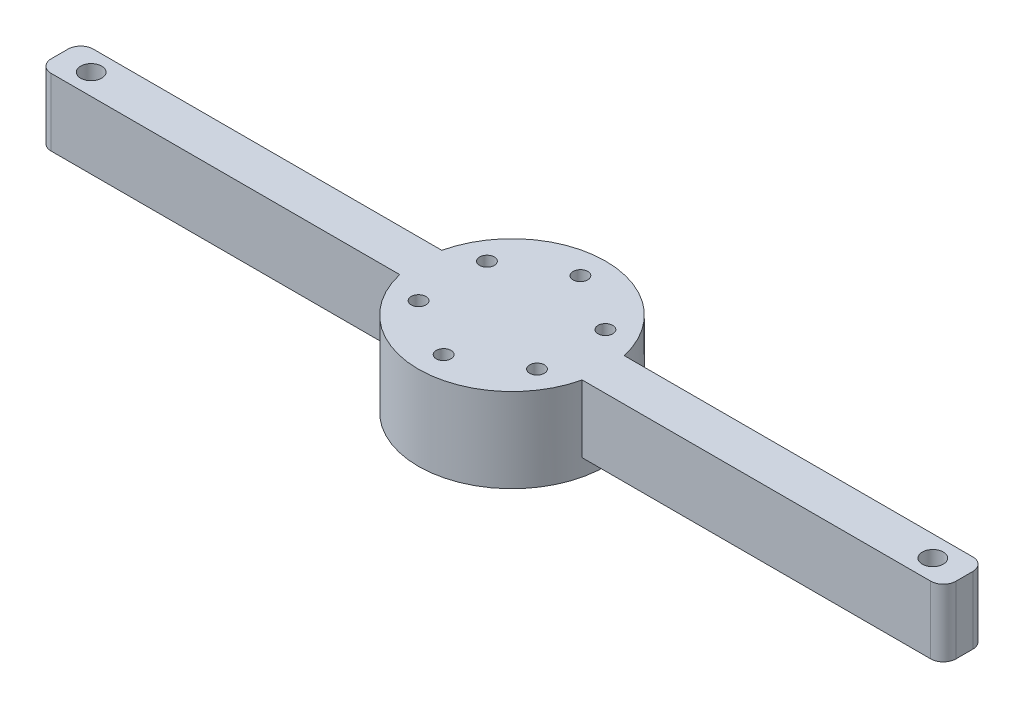
ISO-10303-21;
HEADER;
FILE_DESCRIPTION(('STEP AP214'),'2;1');
FILE_NAME('part.step','',(''),(''),'','','');
FILE_SCHEMA(('AUTOMOTIVE_DESIGN { 1 0 10303 214 1 1 1 1 }'));
ENDSEC;
DATA;
#1=APPLICATION_CONTEXT('core data for automotive mechanical design processes');
#2=APPLICATION_PROTOCOL_DEFINITION('international standard','automotive_design',2000,#1);
#3=PRODUCT_CONTEXT('',#1,'mechanical');
#4=PRODUCT('Part','Part','',(#3));
#5=PRODUCT_RELATED_PRODUCT_CATEGORY('part','',(#4));
#6=PRODUCT_DEFINITION_FORMATION('','',#4);
#7=PRODUCT_DEFINITION_CONTEXT('part definition',#1,'design');
#8=PRODUCT_DEFINITION('design','',#6,#7);
#9=PRODUCT_DEFINITION_SHAPE('','',#8);
#10=(LENGTH_UNIT() NAMED_UNIT(*) SI_UNIT(.MILLI.,.METRE.));
#11=(NAMED_UNIT(*) PLANE_ANGLE_UNIT() SI_UNIT($,.RADIAN.));
#12=(NAMED_UNIT(*) SI_UNIT($,.STERADIAN.) SOLID_ANGLE_UNIT());
#13=UNCERTAINTY_MEASURE_WITH_UNIT(LENGTH_MEASURE(1.E-05),#10,'distance_accuracy_value','');
#14=(GEOMETRIC_REPRESENTATION_CONTEXT(3) GLOBAL_UNCERTAINTY_ASSIGNED_CONTEXT((#13)) GLOBAL_UNIT_ASSIGNED_CONTEXT((#10,
#11,#12)) REPRESENTATION_CONTEXT('',''));
#15=CARTESIAN_POINT('',(0.,0.,0.));
#16=DIRECTION('',(0.,0.,1.));
#17=DIRECTION('',(1.,0.,0.));
#18=AXIS2_PLACEMENT_3D('',#15,#16,#17);
#19=CARTESIAN_POINT('',(-107.5,20.,2.));
#20=DIRECTION('',(1.,0.,0.));
#21=DIRECTION('',(0.,0.,-1.));
#22=AXIS2_PLACEMENT_3D('',#19,#20,#21);
#23=PLANE('',#22);
#24=DIRECTION('',(0.,0.,-1.));
#25=VECTOR('',#24,1.);
#26=CARTESIAN_POINT('',(-107.5,4.,2.));
#27=LINE('',#26,#25);
#28=CARTESIAN_POINT('',(-107.5,4.,2.));
#29=VERTEX_POINT('',#28);
#30=CARTESIAN_POINT('',(-107.5,4.,-2.));
#31=VERTEX_POINT('',#30);
#32=EDGE_CURVE('E393',#29,#31,#27,.T.);
#33=ORIENTED_EDGE('',*,*,#32,.F.);
#34=DIRECTION('',(0.,-1.,0.));
#35=VECTOR('',#34,1.);
#36=CARTESIAN_POINT('',(-107.5,20.,2.));
#37=LINE('',#36,#35);
#38=CARTESIAN_POINT('',(-107.5,20.,2.));
#39=VERTEX_POINT('',#38);
#40=EDGE_CURVE('E360',#39,#29,#37,.T.);
#41=ORIENTED_EDGE('',*,*,#40,.F.);
#42=DIRECTION('',(0.,0.,1.));
#43=VECTOR('',#42,1.);
#44=CARTESIAN_POINT('',(-107.5,20.,2.));
#45=LINE('',#44,#43);
#46=CARTESIAN_POINT('',(-107.5,20.,-2.));
#47=VERTEX_POINT('',#46);
#48=EDGE_CURVE('E342',#47,#39,#45,.T.);
#49=ORIENTED_EDGE('',*,*,#48,.F.);
#50=DIRECTION('',(0.,-1.,0.));
#51=VECTOR('',#50,1.);
#52=CARTESIAN_POINT('',(-107.5,20.,-2.));
#53=LINE('',#52,#51);
#54=EDGE_CURVE('E361',#47,#31,#53,.T.);
#55=ORIENTED_EDGE('',*,*,#54,.T.);
#56=EDGE_LOOP('',(#33,#41,#49,#55));
#57=FACE_BOUND('',#56,.T.);
#58=ADVANCED_FACE('F50',(#57),#23,.F.);
#59=CARTESIAN_POINT('',(-104.5,20.,5.));
#60=DIRECTION('',(0.,0.,-1.));
#61=DIRECTION('',(-1.,0.,0.));
#62=AXIS2_PLACEMENT_3D('',#59,#60,#61);
#63=PLANE('',#62);
#64=DIRECTION('',(-1.,0.,0.));
#65=VECTOR('',#64,1.);
#66=CARTESIAN_POINT('',(-21.6809247957738,4.,4.99999999999999));
#67=LINE('',#66,#65);
#68=CARTESIAN_POINT('',(-21.6809247957738,4.,4.99999999999999));
#69=VERTEX_POINT('',#68);
#70=CARTESIAN_POINT('',(-104.5,4.,5.));
#71=VERTEX_POINT('',#70);
#72=EDGE_CURVE('E381',#69,#71,#67,.T.);
#73=ORIENTED_EDGE('',*,*,#72,.F.);
#74=DIRECTION('',(0.,-1.,0.));
#75=VECTOR('',#74,1.);
#76=CARTESIAN_POINT('',(-21.6809247957738,20.,5.));
#77=LINE('',#76,#75);
#78=CARTESIAN_POINT('',(-21.6809247957738,20.,5.));
#79=VERTEX_POINT('',#78);
#80=EDGE_CURVE('E167',#69,#79,#77,.F.);
#81=ORIENTED_EDGE('',*,*,#80,.T.);
#82=DIRECTION('',(1.,0.,0.));
#83=VECTOR('',#82,1.);
#84=CARTESIAN_POINT('',(-104.5,20.,5.));
#85=LINE('',#84,#83);
#86=CARTESIAN_POINT('',(-104.5,20.,5.));
#87=VERTEX_POINT('',#86);
#88=EDGE_CURVE('E348',#87,#79,#85,.T.);
#89=ORIENTED_EDGE('',*,*,#88,.F.);
#90=DIRECTION('',(0.,-1.,0.));
#91=VECTOR('',#90,1.);
#92=CARTESIAN_POINT('',(-104.5,20.,5.));
#93=LINE('',#92,#91);
#94=EDGE_CURVE('E352',#87,#71,#93,.T.);
#95=ORIENTED_EDGE('',*,*,#94,.T.);
#96=EDGE_LOOP('',(#73,#81,#89,#95));
#97=FACE_BOUND('',#96,.T.);
#98=ADVANCED_FACE('F247',(#97),#63,.F.);
#99=CARTESIAN_POINT('',(-104.5,20.,-5.));
#100=DIRECTION('',(0.,0.,1.));
#101=DIRECTION('',(1.,0.,0.));
#102=AXIS2_PLACEMENT_3D('',#99,#100,#101);
#103=PLANE('',#102);
#104=DIRECTION('',(1.,0.,0.));
#105=VECTOR('',#104,1.);
#106=CARTESIAN_POINT('',(-104.5,4.,-5.00000000000001));
#107=LINE('',#106,#105);
#108=CARTESIAN_POINT('',(-104.5,4.,-5.00000000000002));
#109=VERTEX_POINT('',#108);
#110=CARTESIAN_POINT('',(-21.6809247957738,4.,-5.00000000000001));
#111=VERTEX_POINT('',#110);
#112=EDGE_CURVE('E404',#109,#111,#107,.T.);
#113=ORIENTED_EDGE('',*,*,#112,.F.);
#114=DIRECTION('',(0.,-1.,0.));
#115=VECTOR('',#114,1.);
#116=CARTESIAN_POINT('',(-104.5,20.,-5.00000000000002));
#117=LINE('',#116,#115);
#118=CARTESIAN_POINT('',(-104.5,20.,-5.00000000000002));
#119=VERTEX_POINT('',#118);
#120=EDGE_CURVE('E370',#119,#109,#117,.T.);
#121=ORIENTED_EDGE('',*,*,#120,.F.);
#122=DIRECTION('',(-1.,0.,0.));
#123=VECTOR('',#122,1.);
#124=CARTESIAN_POINT('',(-104.5,20.,-5.));
#125=LINE('',#124,#123);
#126=CARTESIAN_POINT('',(-21.6809247957738,20.,-5.));
#127=VERTEX_POINT('',#126);
#128=EDGE_CURVE('E334',#127,#119,#125,.T.);
#129=ORIENTED_EDGE('',*,*,#128,.F.);
#130=DIRECTION('',(0.,-1.,0.));
#131=VECTOR('',#130,1.);
#132=CARTESIAN_POINT('',(-21.6809247957738,20.,-5.));
#133=LINE('',#132,#131);
#134=EDGE_CURVE('E162',#127,#111,#133,.T.);
#135=ORIENTED_EDGE('',*,*,#134,.T.);
#136=EDGE_LOOP('',(#113,#121,#129,#135));
#137=FACE_BOUND('',#136,.T.);
#138=ADVANCED_FACE('F253',(#137),#103,.F.);
#139=DIRECTION('',(1.,0.,0.));
#140=VECTOR('',#139,1.);
#141=CARTESIAN_POINT('',(104.5,4.,-5.00000000000001));
#142=LINE('',#141,#140);
#143=CARTESIAN_POINT('',(21.6809247957738,4.,-5.));
#144=VERTEX_POINT('',#143);
#145=CARTESIAN_POINT('',(104.5,4.,-5.));
#146=VERTEX_POINT('',#145);
#147=EDGE_CURVE('E71',#144,#146,#142,.T.);
#148=ORIENTED_EDGE('',*,*,#147,.F.);
#149=DIRECTION('',(0.,-1.,0.));
#150=VECTOR('',#149,1.);
#151=CARTESIAN_POINT('',(21.6809247957738,20.,-5.));
#152=LINE('',#151,#150);
#153=CARTESIAN_POINT('',(21.6809247957738,20.,-5.));
#154=VERTEX_POINT('',#153);
#155=EDGE_CURVE('E151',#144,#154,#152,.F.);
#156=ORIENTED_EDGE('',*,*,#155,.T.);
#157=CARTESIAN_POINT('',(104.5,20.,-5.));
#158=VERTEX_POINT('',#157);
#159=EDGE_CURVE('E332',#158,#154,#125,.T.);
#160=ORIENTED_EDGE('',*,*,#159,.F.);
#161=DIRECTION('',(0.,-1.,0.));
#162=VECTOR('',#161,1.);
#163=CARTESIAN_POINT('',(104.5,20.,-5.));
#164=LINE('',#163,#162);
#165=EDGE_CURVE('E152',#158,#146,#164,.T.);
#166=ORIENTED_EDGE('',*,*,#165,.T.);
#167=EDGE_LOOP('',(#148,#156,#160,#166));
#168=FACE_BOUND('',#167,.T.);
#169=ADVANCED_FACE('F146',(#168),#103,.F.);
#170=DIRECTION('',(-1.,0.,0.));
#171=VECTOR('',#170,1.);
#172=CARTESIAN_POINT('',(21.6809247957738,4.,5.));
#173=LINE('',#172,#171);
#174=CARTESIAN_POINT('',(104.5,4.,5.));
#175=VERTEX_POINT('',#174);
#176=CARTESIAN_POINT('',(21.6809247957738,4.,5.));
#177=VERTEX_POINT('',#176);
#178=EDGE_CURVE('E142',#175,#177,#173,.T.);
#179=ORIENTED_EDGE('',*,*,#178,.F.);
#180=DIRECTION('',(0.,-1.,0.));
#181=VECTOR('',#180,1.);
#182=CARTESIAN_POINT('',(104.5,20.,5.));
#183=LINE('',#182,#181);
#184=CARTESIAN_POINT('',(104.5,20.,5.));
#185=VERTEX_POINT('',#184);
#186=EDGE_CURVE('E353',#185,#175,#183,.T.);
#187=ORIENTED_EDGE('',*,*,#186,.F.);
#188=CARTESIAN_POINT('',(21.6809247957738,20.,5.));
#189=VERTEX_POINT('',#188);
#190=EDGE_CURVE('E350',#189,#185,#85,.T.);
#191=ORIENTED_EDGE('',*,*,#190,.F.);
#192=DIRECTION('',(0.,-1.,0.));
#193=VECTOR('',#192,1.);
#194=CARTESIAN_POINT('',(21.6809247957738,20.,5.));
#195=LINE('',#194,#193);
#196=EDGE_CURVE('E161',#189,#177,#195,.T.);
#197=ORIENTED_EDGE('',*,*,#196,.T.);
#198=EDGE_LOOP('',(#179,#187,#191,#197));
#199=FACE_BOUND('',#198,.T.);
#200=ADVANCED_FACE('F239',(#199),#63,.F.);
#201=CARTESIAN_POINT('',(107.5,20.,2.));
#202=DIRECTION('',(-1.,0.,0.));
#203=DIRECTION('',(0.,0.,1.));
#204=AXIS2_PLACEMENT_3D('',#201,#202,#203);
#205=PLANE('',#204);
#206=DIRECTION('',(0.,0.,1.));
#207=VECTOR('',#206,1.);
#208=CARTESIAN_POINT('',(107.5,4.,2.));
#209=LINE('',#208,#207);
#210=CARTESIAN_POINT('',(107.5,4.,-2.));
#211=VERTEX_POINT('',#210);
#212=CARTESIAN_POINT('',(107.5,4.,2.));
#213=VERTEX_POINT('',#212);
#214=EDGE_CURVE('E422',#211,#213,#209,.T.);
#215=ORIENTED_EDGE('',*,*,#214,.F.);
#216=DIRECTION('',(0.,-1.,0.));
#217=VECTOR('',#216,1.);
#218=CARTESIAN_POINT('',(107.5,20.,-2.));
#219=LINE('',#218,#217);
#220=CARTESIAN_POINT('',(107.5,20.,-2.));
#221=VERTEX_POINT('',#220);
#222=EDGE_CURVE('E373',#221,#211,#219,.T.);
#223=ORIENTED_EDGE('',*,*,#222,.F.);
#224=DIRECTION('',(0.,0.,-1.));
#225=VECTOR('',#224,1.);
#226=CARTESIAN_POINT('',(107.5,20.,2.));
#227=LINE('',#226,#225);
#228=CARTESIAN_POINT('',(107.5,20.,2.));
#229=VERTEX_POINT('',#228);
#230=EDGE_CURVE('E328',#229,#221,#227,.T.);
#231=ORIENTED_EDGE('',*,*,#230,.F.);
#232=DIRECTION('',(0.,-1.,0.));
#233=VECTOR('',#232,1.);
#234=CARTESIAN_POINT('',(107.5,20.,2.));
#235=LINE('',#234,#233);
#236=EDGE_CURVE('E380',#229,#213,#235,.T.);
#237=ORIENTED_EDGE('',*,*,#236,.T.);
#238=EDGE_LOOP('',(#215,#223,#231,#237));
#239=FACE_BOUND('',#238,.T.);
#240=ADVANCED_FACE('F229',(#239),#205,.F.);
#241=CARTESIAN_POINT('',(0.,0.,0.));
#242=DIRECTION('',(0.,1.,0.));
#243=DIRECTION('',(0.,0.,1.));
#244=AXIS2_PLACEMENT_3D('',#241,#242,#243);
#245=PLANE('',#244);
#246=CARTESIAN_POINT('',(0.,0.,0.));
#247=DIRECTION('',(0.,1.,0.));
#248=DIRECTION('',(0.,0.,1.));
#249=AXIS2_PLACEMENT_3D('',#246,#247,#248);
#250=CIRCLE('',#249,12.5);
#251=CARTESIAN_POINT('',(0.,0.,12.5));
#252=VERTEX_POINT('',#251);
#253=EDGE_CURVE('E322',#252,#252,#250,.T.);
#254=ORIENTED_EDGE('',*,*,#253,.T.);
#255=EDGE_LOOP('',(#254));
#256=FACE_BOUND('',#255,.T.);
#257=CARTESIAN_POINT('',(-14.0729128114971,0.,-8.12499999999999));
#258=DIRECTION('',(0.,1.,0.));
#259=DIRECTION('',(0.,0.,1.));
#260=AXIS2_PLACEMENT_3D('',#257,#258,#259);
#261=CIRCLE('',#260,1.75);
#262=CARTESIAN_POINT('',(-14.0729128114971,0.,-6.37499999999999));
#263=VERTEX_POINT('',#262);
#264=EDGE_CURVE('E166',#263,#263,#261,.T.);
#265=ORIENTED_EDGE('',*,*,#264,.T.);
#266=EDGE_LOOP('',(#265));
#267=FACE_BOUND('',#266,.T.);
#268=CARTESIAN_POINT('',(14.0729128114971,0.,-8.12500000000001));
#269=DIRECTION('',(0.,1.,0.));
#270=DIRECTION('',(0.,0.,1.));
#271=AXIS2_PLACEMENT_3D('',#268,#269,#270);
#272=CIRCLE('',#271,1.75);
#273=CARTESIAN_POINT('',(14.0729128114971,0.,-6.37500000000001));
#274=VERTEX_POINT('',#273);
#275=EDGE_CURVE('E216',#274,#274,#272,.T.);
#276=ORIENTED_EDGE('',*,*,#275,.T.);
#277=EDGE_LOOP('',(#276));
#278=FACE_BOUND('',#277,.T.);
#279=CARTESIAN_POINT('',(0.,0.,-16.25));
#280=DIRECTION('',(0.,1.,0.));
#281=DIRECTION('',(0.,0.,1.));
#282=AXIS2_PLACEMENT_3D('',#279,#280,#281);
#283=CIRCLE('',#282,1.75);
#284=CARTESIAN_POINT('',(0.,0.,-14.5));
#285=VERTEX_POINT('',#284);
#286=EDGE_CURVE('E219',#285,#285,#283,.T.);
#287=ORIENTED_EDGE('',*,*,#286,.T.);
#288=EDGE_LOOP('',(#287));
#289=FACE_BOUND('',#288,.T.);
#290=CARTESIAN_POINT('',(14.0729128114971,0.,8.125));
#291=DIRECTION('',(0.,1.,0.));
#292=DIRECTION('',(0.,0.,1.));
#293=AXIS2_PLACEMENT_3D('',#290,#291,#292);
#294=CIRCLE('',#293,1.75);
#295=CARTESIAN_POINT('',(14.0729128114971,0.,9.875));
#296=VERTEX_POINT('',#295);
#297=EDGE_CURVE('E215',#296,#296,#294,.T.);
#298=ORIENTED_EDGE('',*,*,#297,.T.);
#299=EDGE_LOOP('',(#298));
#300=FACE_BOUND('',#299,.T.);
#301=CARTESIAN_POINT('',(0.,0.,16.25));
#302=DIRECTION('',(0.,1.,0.));
#303=DIRECTION('',(0.,0.,1.));
#304=AXIS2_PLACEMENT_3D('',#301,#302,#303);
#305=CIRCLE('',#304,1.75);
#306=CARTESIAN_POINT('',(0.,0.,18.));
#307=VERTEX_POINT('',#306);
#308=EDGE_CURVE('E206',#307,#307,#305,.T.);
#309=ORIENTED_EDGE('',*,*,#308,.T.);
#310=EDGE_LOOP('',(#309));
#311=FACE_BOUND('',#310,.T.);
#312=CARTESIAN_POINT('',(-14.0729128114971,0.,8.12500000000001));
#313=DIRECTION('',(0.,1.,0.));
#314=DIRECTION('',(0.,0.,1.));
#315=AXIS2_PLACEMENT_3D('',#312,#313,#314);
#316=CIRCLE('',#315,1.75);
#317=CARTESIAN_POINT('',(-14.0729128114971,0.,9.87500000000001));
#318=VERTEX_POINT('',#317);
#319=EDGE_CURVE('E204',#318,#318,#316,.T.);
#320=ORIENTED_EDGE('',*,*,#319,.T.);
#321=EDGE_LOOP('',(#320));
#322=FACE_BOUND('',#321,.T.);
#323=CARTESIAN_POINT('',(0.,0.,0.));
#324=DIRECTION('',(0.,1.,0.));
#325=DIRECTION('',(0.,0.,1.));
#326=AXIS2_PLACEMENT_3D('',#323,#324,#325);
#327=CIRCLE('',#326,22.25);
#328=CARTESIAN_POINT('',(0.,0.,22.25));
#329=VERTEX_POINT('',#328);
#330=EDGE_CURVE('E177',#329,#329,#327,.T.);
#331=ORIENTED_EDGE('',*,*,#330,.F.);
#332=EDGE_LOOP('',(#331));
#333=FACE_BOUND('',#332,.T.);
#334=ADVANCED_FACE('F227',(#256,#267,#278,#289,#300,#311,#322,#333),#245,.F.);
#335=CARTESIAN_POINT('',(-100.,20.,0.));
#336=DIRECTION('',(0.,-1.,0.));
#337=DIRECTION('',(0.,0.,-1.));
#338=AXIS2_PLACEMENT_3D('',#335,#336,#337);
#339=CYLINDRICAL_SURFACE('',#338,2.5);
#340=CARTESIAN_POINT('',(-100.,20.,0.));
#341=DIRECTION('',(0.,1.,0.));
#342=DIRECTION('',(0.,0.,1.));
#343=AXIS2_PLACEMENT_3D('',#340,#341,#342);
#344=CIRCLE('',#343,2.5);
#345=CARTESIAN_POINT('',(-100.,20.,2.49999999999999));
#346=VERTEX_POINT('',#345);
#347=EDGE_CURVE('E308',#346,#346,#344,.T.);
#348=ORIENTED_EDGE('',*,*,#347,.T.);
#349=EDGE_LOOP('',(#348));
#350=FACE_BOUND('',#349,.T.);
#351=CARTESIAN_POINT('',(-100.,4.,0.));
#352=DIRECTION('',(0.,-1.,0.));
#353=DIRECTION('',(0.,0.,-1.));
#354=AXIS2_PLACEMENT_3D('',#351,#352,#353);
#355=CIRCLE('',#354,2.5);
#356=CARTESIAN_POINT('',(-100.,4.,-2.5));
#357=VERTEX_POINT('',#356);
#358=EDGE_CURVE('E406',#357,#357,#355,.T.);
#359=ORIENTED_EDGE('',*,*,#358,.T.);
#360=EDGE_LOOP('',(#359));
#361=FACE_BOUND('',#360,.T.);
#362=ADVANCED_FACE('F230',(#350,#361),#339,.F.);
#363=CARTESIAN_POINT('',(-104.5,20.,-2.));
#364=DIRECTION('',(0.,-1.,0.));
#365=DIRECTION('',(0.,0.,-1.));
#366=AXIS2_PLACEMENT_3D('',#363,#364,#365);
#367=CYLINDRICAL_SURFACE('',#366,3.00000000000002);
#368=CARTESIAN_POINT('',(-104.5,4.,-2.));
#369=DIRECTION('',(0.,-1.,0.));
#370=DIRECTION('',(0.,0.,-1.));
#371=AXIS2_PLACEMENT_3D('',#368,#369,#370);
#372=CIRCLE('',#371,3.00000000000001);
#373=EDGE_CURVE('E63',#31,#109,#372,.T.);
#374=ORIENTED_EDGE('',*,*,#373,.F.);
#375=ORIENTED_EDGE('',*,*,#54,.F.);
#376=CARTESIAN_POINT('',(-104.5,20.,-2.));
#377=DIRECTION('',(0.,1.,0.));
#378=DIRECTION('',(0.,0.,-1.));
#379=AXIS2_PLACEMENT_3D('',#376,#377,#378);
#380=CIRCLE('',#379,3.00000000000002);
#381=EDGE_CURVE('E336',#119,#47,#380,.T.);
#382=ORIENTED_EDGE('',*,*,#381,.F.);
#383=ORIENTED_EDGE('',*,*,#120,.T.);
#384=EDGE_LOOP('',(#374,#375,#382,#383));
#385=FACE_BOUND('',#384,.T.);
#386=ADVANCED_FACE('F240',(#385),#367,.T.);
#387=CARTESIAN_POINT('',(-104.5,20.,2.));
#388=DIRECTION('',(0.,-1.,0.));
#389=DIRECTION('',(0.,0.,-1.));
#390=AXIS2_PLACEMENT_3D('',#387,#388,#389);
#391=CYLINDRICAL_SURFACE('',#390,3.);
#392=CARTESIAN_POINT('',(-104.5,4.,1.99999999999999));
#393=DIRECTION('',(0.,-1.,0.));
#394=DIRECTION('',(0.,0.,-1.));
#395=AXIS2_PLACEMENT_3D('',#392,#393,#394);
#396=CIRCLE('',#395,3.00000000000001);
#397=EDGE_CURVE('E391',#71,#29,#396,.T.);
#398=ORIENTED_EDGE('',*,*,#397,.F.);
#399=ORIENTED_EDGE('',*,*,#94,.F.);
#400=CARTESIAN_POINT('',(-104.5,20.,2.));
#401=DIRECTION('',(0.,1.,0.));
#402=DIRECTION('',(0.,0.,-1.));
#403=AXIS2_PLACEMENT_3D('',#400,#401,#402);
#404=CIRCLE('',#403,3.);
#405=EDGE_CURVE('E341',#39,#87,#404,.T.);
#406=ORIENTED_EDGE('',*,*,#405,.F.);
#407=ORIENTED_EDGE('',*,*,#40,.T.);
#408=EDGE_LOOP('',(#398,#399,#406,#407));
#409=FACE_BOUND('',#408,.T.);
#410=ADVANCED_FACE('F261',(#409),#391,.T.);
#411=CARTESIAN_POINT('',(104.5,20.,2.));
#412=DIRECTION('',(0.,-1.,0.));
#413=DIRECTION('',(0.,0.,-1.));
#414=AXIS2_PLACEMENT_3D('',#411,#412,#413);
#415=CYLINDRICAL_SURFACE('',#414,3.);
#416=CARTESIAN_POINT('',(104.5,4.,1.99999999999999));
#417=DIRECTION('',(0.,-1.,0.));
#418=DIRECTION('',(0.,0.,1.));
#419=AXIS2_PLACEMENT_3D('',#416,#417,#418);
#420=CIRCLE('',#419,3.00000000000001);
#421=EDGE_CURVE('E417',#213,#175,#420,.T.);
#422=ORIENTED_EDGE('',*,*,#421,.F.);
#423=ORIENTED_EDGE('',*,*,#236,.F.);
#424=CARTESIAN_POINT('',(104.5,20.,2.));
#425=DIRECTION('',(0.,1.,0.));
#426=DIRECTION('',(0.,0.,1.));
#427=AXIS2_PLACEMENT_3D('',#424,#425,#426);
#428=CIRCLE('',#427,3.);
#429=EDGE_CURVE('E319',#185,#229,#428,.T.);
#430=ORIENTED_EDGE('',*,*,#429,.F.);
#431=ORIENTED_EDGE('',*,*,#186,.T.);
#432=EDGE_LOOP('',(#422,#423,#430,#431));
#433=FACE_BOUND('',#432,.T.);
#434=ADVANCED_FACE('F272',(#433),#415,.T.);
#435=CARTESIAN_POINT('',(104.5,20.,-2.));
#436=DIRECTION('',(0.,-1.,0.));
#437=DIRECTION('',(0.,0.,-1.));
#438=AXIS2_PLACEMENT_3D('',#435,#436,#437);
#439=CYLINDRICAL_SURFACE('',#438,3.00000000000002);
#440=CARTESIAN_POINT('',(104.5,4.,-2.));
#441=DIRECTION('',(0.,-1.,0.));
#442=DIRECTION('',(0.,0.,1.));
#443=AXIS2_PLACEMENT_3D('',#440,#441,#442);
#444=CIRCLE('',#443,3.00000000000001);
#445=EDGE_CURVE('E158',#146,#211,#444,.T.);
#446=ORIENTED_EDGE('',*,*,#445,.F.);
#447=ORIENTED_EDGE('',*,*,#165,.F.);
#448=CARTESIAN_POINT('',(104.5,20.,-2.));
#449=DIRECTION('',(0.,1.,0.));
#450=DIRECTION('',(0.,0.,-1.));
#451=AXIS2_PLACEMENT_3D('',#448,#449,#450);
#452=CIRCLE('',#451,3.00000000000002);
#453=EDGE_CURVE('E333',#221,#158,#452,.T.);
#454=ORIENTED_EDGE('',*,*,#453,.F.);
#455=ORIENTED_EDGE('',*,*,#222,.T.);
#456=EDGE_LOOP('',(#446,#447,#454,#455));
#457=FACE_BOUND('',#456,.T.);
#458=ADVANCED_FACE('F266',(#457),#439,.T.);
#459=CARTESIAN_POINT('',(100.,20.,0.));
#460=DIRECTION('',(0.,-1.,0.));
#461=DIRECTION('',(0.,0.,-1.));
#462=AXIS2_PLACEMENT_3D('',#459,#460,#461);
#463=CYLINDRICAL_SURFACE('',#462,2.49999999999999);
#464=CARTESIAN_POINT('',(100.,20.,0.));
#465=DIRECTION('',(0.,1.,0.));
#466=DIRECTION('',(0.,0.,1.));
#467=AXIS2_PLACEMENT_3D('',#464,#465,#466);
#468=CIRCLE('',#467,2.49999999999999);
#469=CARTESIAN_POINT('',(100.,20.,2.49999999999999));
#470=VERTEX_POINT('',#469);
#471=EDGE_CURVE('E311',#470,#470,#468,.T.);
#472=ORIENTED_EDGE('',*,*,#471,.T.);
#473=EDGE_LOOP('',(#472));
#474=FACE_BOUND('',#473,.T.);
#475=CARTESIAN_POINT('',(100.,4.,0.));
#476=DIRECTION('',(0.,-1.,0.));
#477=DIRECTION('',(0.,0.,-1.));
#478=AXIS2_PLACEMENT_3D('',#475,#476,#477);
#479=CIRCLE('',#478,2.49999999999999);
#480=CARTESIAN_POINT('',(100.,4.,-2.5));
#481=VERTEX_POINT('',#480);
#482=EDGE_CURVE('E51',#481,#481,#479,.T.);
#483=ORIENTED_EDGE('',*,*,#482,.T.);
#484=EDGE_LOOP('',(#483));
#485=FACE_BOUND('',#484,.T.);
#486=ADVANCED_FACE('F267',(#474,#485),#463,.F.);
#487=CARTESIAN_POINT('',(0.,20.,0.));
#488=DIRECTION('',(0.,-1.,0.));
#489=DIRECTION('',(0.,0.,-1.));
#490=AXIS2_PLACEMENT_3D('',#487,#488,#489);
#491=CYLINDRICAL_SURFACE('',#490,22.25);
#492=ORIENTED_EDGE('',*,*,#155,.F.);
#493=CARTESIAN_POINT('',(9.57567358739198E-13,4.,0.));
#494=DIRECTION('',(0.,1.,0.));
#495=DIRECTION('',(0.,0.,-1.));
#496=AXIS2_PLACEMENT_3D('',#493,#494,#495);
#497=CIRCLE('',#496,22.2499999999991);
#498=EDGE_CURVE('E136',#177,#144,#497,.T.);
#499=ORIENTED_EDGE('',*,*,#498,.F.);
#500=ORIENTED_EDGE('',*,*,#196,.F.);
#501=CARTESIAN_POINT('',(0.,20.,0.));
#502=DIRECTION('',(0.,1.,0.));
#503=DIRECTION('',(0.,0.,1.));
#504=AXIS2_PLACEMENT_3D('',#501,#502,#503);
#505=CIRCLE('',#504,22.25);
#506=EDGE_CURVE('E60',#79,#189,#505,.T.);
#507=ORIENTED_EDGE('',*,*,#506,.F.);
#508=ORIENTED_EDGE('',*,*,#80,.F.);
#509=CARTESIAN_POINT('',(9.57567358739198E-13,4.,0.));
#510=DIRECTION('',(0.,1.,0.));
#511=DIRECTION('',(0.,0.,1.));
#512=AXIS2_PLACEMENT_3D('',#509,#510,#511);
#513=CIRCLE('',#512,22.2500000000009);
#514=EDGE_CURVE('E400',#111,#69,#513,.T.);
#515=ORIENTED_EDGE('',*,*,#514,.F.);
#516=ORIENTED_EDGE('',*,*,#134,.F.);
#517=EDGE_CURVE('E11',#154,#127,#505,.T.);
#518=ORIENTED_EDGE('',*,*,#517,.F.);
#519=EDGE_LOOP('',(#492,#499,#500,#507,#508,#515,#516,#518));
#520=FACE_BOUND('',#519,.T.);
#521=ORIENTED_EDGE('',*,*,#330,.T.);
#522=EDGE_LOOP('',(#521));
#523=FACE_BOUND('',#522,.T.);
#524=ADVANCED_FACE('F156',(#520,#523),#491,.T.);
#525=CARTESIAN_POINT('',(0.,20.,-16.25));
#526=DIRECTION('',(0.,-1.,0.));
#527=DIRECTION('',(0.,0.,-1.));
#528=AXIS2_PLACEMENT_3D('',#525,#526,#527);
#529=CYLINDRICAL_SURFACE('',#528,1.75);
#530=CARTESIAN_POINT('',(0.,20.,-16.25));
#531=DIRECTION('',(0.,1.,0.));
#532=DIRECTION('',(0.,0.,1.));
#533=AXIS2_PLACEMENT_3D('',#530,#531,#532);
#534=CIRCLE('',#533,1.75);
#535=CARTESIAN_POINT('',(0.,20.,-14.5));
#536=VERTEX_POINT('',#535);
#537=EDGE_CURVE('E193',#536,#536,#534,.T.);
#538=ORIENTED_EDGE('',*,*,#537,.T.);
#539=EDGE_LOOP('',(#538));
#540=FACE_BOUND('',#539,.T.);
#541=ORIENTED_EDGE('',*,*,#286,.F.);
#542=EDGE_LOOP('',(#541));
#543=FACE_BOUND('',#542,.T.);
#544=ADVANCED_FACE('F458',(#540,#543),#529,.F.);
#545=CARTESIAN_POINT('',(14.0729128114971,20.,-8.12500000000001));
#546=DIRECTION('',(0.,-1.,0.));
#547=DIRECTION('',(0.,0.,-1.));
#548=AXIS2_PLACEMENT_3D('',#545,#546,#547);
#549=CYLINDRICAL_SURFACE('',#548,1.75);
#550=CARTESIAN_POINT('',(14.0729128114971,20.,-8.12500000000001));
#551=DIRECTION('',(0.,1.,0.));
#552=DIRECTION('',(0.,0.,1.));
#553=AXIS2_PLACEMENT_3D('',#550,#551,#552);
#554=CIRCLE('',#553,1.75);
#555=CARTESIAN_POINT('',(14.0729128114971,20.,-6.37500000000001));
#556=VERTEX_POINT('',#555);
#557=EDGE_CURVE('E192',#556,#556,#554,.T.);
#558=ORIENTED_EDGE('',*,*,#557,.T.);
#559=EDGE_LOOP('',(#558));
#560=FACE_BOUND('',#559,.T.);
#561=ORIENTED_EDGE('',*,*,#275,.F.);
#562=EDGE_LOOP('',(#561));
#563=FACE_BOUND('',#562,.T.);
#564=ADVANCED_FACE('F465',(#560,#563),#549,.F.);
#565=CARTESIAN_POINT('',(14.0729128114971,20.,8.125));
#566=DIRECTION('',(0.,-1.,0.));
#567=DIRECTION('',(0.,0.,-1.));
#568=AXIS2_PLACEMENT_3D('',#565,#566,#567);
#569=CYLINDRICAL_SURFACE('',#568,1.75);
#570=CARTESIAN_POINT('',(14.0729128114971,20.,8.125));
#571=DIRECTION('',(0.,1.,0.));
#572=DIRECTION('',(0.,0.,1.));
#573=AXIS2_PLACEMENT_3D('',#570,#571,#572);
#574=CIRCLE('',#573,1.75);
#575=CARTESIAN_POINT('',(14.0729128114971,20.,9.875));
#576=VERTEX_POINT('',#575);
#577=EDGE_CURVE('E190',#576,#576,#574,.T.);
#578=ORIENTED_EDGE('',*,*,#577,.T.);
#579=EDGE_LOOP('',(#578));
#580=FACE_BOUND('',#579,.T.);
#581=ORIENTED_EDGE('',*,*,#297,.F.);
#582=EDGE_LOOP('',(#581));
#583=FACE_BOUND('',#582,.T.);
#584=ADVANCED_FACE('F466',(#580,#583),#569,.F.);
#585=CARTESIAN_POINT('',(0.,20.,16.25));
#586=DIRECTION('',(0.,-1.,0.));
#587=DIRECTION('',(0.,0.,-1.));
#588=AXIS2_PLACEMENT_3D('',#585,#586,#587);
#589=CYLINDRICAL_SURFACE('',#588,1.75);
#590=CARTESIAN_POINT('',(0.,20.,16.25));
#591=DIRECTION('',(0.,1.,0.));
#592=DIRECTION('',(0.,0.,1.));
#593=AXIS2_PLACEMENT_3D('',#590,#591,#592);
#594=CIRCLE('',#593,1.75);
#595=CARTESIAN_POINT('',(0.,20.,18.));
#596=VERTEX_POINT('',#595);
#597=EDGE_CURVE('E182',#596,#596,#594,.T.);
#598=ORIENTED_EDGE('',*,*,#597,.T.);
#599=EDGE_LOOP('',(#598));
#600=FACE_BOUND('',#599,.T.);
#601=ORIENTED_EDGE('',*,*,#308,.F.);
#602=EDGE_LOOP('',(#601));
#603=FACE_BOUND('',#602,.T.);
#604=ADVANCED_FACE('F475',(#600,#603),#589,.F.);
#605=CARTESIAN_POINT('',(-14.0729128114971,20.,8.12500000000001));
#606=DIRECTION('',(0.,-1.,0.));
#607=DIRECTION('',(0.,0.,-1.));
#608=AXIS2_PLACEMENT_3D('',#605,#606,#607);
#609=CYLINDRICAL_SURFACE('',#608,1.75);
#610=CARTESIAN_POINT('',(-14.0729128114971,20.,8.12500000000001));
#611=DIRECTION('',(0.,1.,0.));
#612=DIRECTION('',(0.,0.,1.));
#613=AXIS2_PLACEMENT_3D('',#610,#611,#612);
#614=CIRCLE('',#613,1.75);
#615=CARTESIAN_POINT('',(-14.0729128114971,20.,9.87500000000001));
#616=VERTEX_POINT('',#615);
#617=EDGE_CURVE('E178',#616,#616,#614,.T.);
#618=ORIENTED_EDGE('',*,*,#617,.T.);
#619=EDGE_LOOP('',(#618));
#620=FACE_BOUND('',#619,.T.);
#621=ORIENTED_EDGE('',*,*,#319,.F.);
#622=EDGE_LOOP('',(#621));
#623=FACE_BOUND('',#622,.T.);
#624=ADVANCED_FACE('F290',(#620,#623),#609,.F.);
#625=CARTESIAN_POINT('',(-14.0729128114971,20.,-8.12499999999999));
#626=DIRECTION('',(0.,-1.,0.));
#627=DIRECTION('',(0.,0.,-1.));
#628=AXIS2_PLACEMENT_3D('',#625,#626,#627);
#629=CYLINDRICAL_SURFACE('',#628,1.75);
#630=CARTESIAN_POINT('',(-14.0729128114971,20.,-8.12499999999999));
#631=DIRECTION('',(0.,1.,0.));
#632=DIRECTION('',(0.,0.,1.));
#633=AXIS2_PLACEMENT_3D('',#630,#631,#632);
#634=CIRCLE('',#633,1.75);
#635=CARTESIAN_POINT('',(-14.0729128114971,20.,-6.37499999999999));
#636=VERTEX_POINT('',#635);
#637=EDGE_CURVE('E172',#636,#636,#634,.T.);
#638=ORIENTED_EDGE('',*,*,#637,.T.);
#639=EDGE_LOOP('',(#638));
#640=FACE_BOUND('',#639,.T.);
#641=ORIENTED_EDGE('',*,*,#264,.F.);
#642=EDGE_LOOP('',(#641));
#643=FACE_BOUND('',#642,.T.);
#644=ADVANCED_FACE('F47',(#640,#643),#629,.F.);
#645=CARTESIAN_POINT('',(0.,20.,0.));
#646=DIRECTION('',(0.,1.,0.));
#647=DIRECTION('',(0.,0.,1.));
#648=AXIS2_PLACEMENT_3D('',#645,#646,#647);
#649=PLANE('',#648);
#650=ORIENTED_EDGE('',*,*,#506,.T.);
#651=ORIENTED_EDGE('',*,*,#190,.T.);
#652=ORIENTED_EDGE('',*,*,#429,.T.);
#653=ORIENTED_EDGE('',*,*,#230,.T.);
#654=ORIENTED_EDGE('',*,*,#453,.T.);
#655=ORIENTED_EDGE('',*,*,#159,.T.);
#656=ORIENTED_EDGE('',*,*,#517,.T.);
#657=ORIENTED_EDGE('',*,*,#128,.T.);
#658=ORIENTED_EDGE('',*,*,#381,.T.);
#659=ORIENTED_EDGE('',*,*,#48,.T.);
#660=ORIENTED_EDGE('',*,*,#405,.T.);
#661=ORIENTED_EDGE('',*,*,#88,.T.);
#662=EDGE_LOOP('',(#650,#651,#652,#653,#654,#655,#656,#657,#658,#659,#660,#661));
#663=FACE_BOUND('',#662,.T.);
#664=ORIENTED_EDGE('',*,*,#617,.F.);
#665=EDGE_LOOP('',(#664));
#666=FACE_BOUND('',#665,.T.);
#667=ORIENTED_EDGE('',*,*,#597,.F.);
#668=EDGE_LOOP('',(#667));
#669=FACE_BOUND('',#668,.T.);
#670=ORIENTED_EDGE('',*,*,#577,.F.);
#671=EDGE_LOOP('',(#670));
#672=FACE_BOUND('',#671,.T.);
#673=ORIENTED_EDGE('',*,*,#537,.F.);
#674=EDGE_LOOP('',(#673));
#675=FACE_BOUND('',#674,.T.);
#676=ORIENTED_EDGE('',*,*,#557,.F.);
#677=EDGE_LOOP('',(#676));
#678=FACE_BOUND('',#677,.T.);
#679=ORIENTED_EDGE('',*,*,#637,.F.);
#680=EDGE_LOOP('',(#679));
#681=FACE_BOUND('',#680,.T.);
#682=ORIENTED_EDGE('',*,*,#347,.F.);
#683=EDGE_LOOP('',(#682));
#684=FACE_BOUND('',#683,.T.);
#685=ORIENTED_EDGE('',*,*,#471,.F.);
#686=EDGE_LOOP('',(#685));
#687=FACE_BOUND('',#686,.T.);
#688=ADVANCED_FACE('F277',(#663,#666,#669,#672,#675,#678,#681,#684,#687),#649,.T.);
#689=CARTESIAN_POINT('',(0.,3.,0.));
#690=DIRECTION('',(0.,-1.,0.));
#691=DIRECTION('',(0.,0.,-1.));
#692=AXIS2_PLACEMENT_3D('',#689,#690,#691);
#693=CYLINDRICAL_SURFACE('',#692,12.5);
#694=CARTESIAN_POINT('',(0.,3.,0.));
#695=DIRECTION('',(0.,1.,0.));
#696=DIRECTION('',(0.,0.,1.));
#697=AXIS2_PLACEMENT_3D('',#694,#695,#696);
#698=CIRCLE('',#697,12.5);
#699=CARTESIAN_POINT('',(0.,3.,12.5));
#700=VERTEX_POINT('',#699);
#701=EDGE_CURVE('E313',#700,#700,#698,.T.);
#702=ORIENTED_EDGE('',*,*,#701,.T.);
#703=EDGE_LOOP('',(#702));
#704=FACE_BOUND('',#703,.T.);
#705=ORIENTED_EDGE('',*,*,#253,.F.);
#706=EDGE_LOOP('',(#705));
#707=FACE_BOUND('',#706,.T.);
#708=ADVANCED_FACE('F279',(#704,#707),#693,.F.);
#709=CARTESIAN_POINT('',(0.,3.,0.));
#710=DIRECTION('',(0.,1.,0.));
#711=DIRECTION('',(0.,0.,1.));
#712=AXIS2_PLACEMENT_3D('',#709,#710,#711);
#713=PLANE('',#712);
#714=ORIENTED_EDGE('',*,*,#701,.F.);
#715=EDGE_LOOP('',(#714));
#716=FACE_BOUND('',#715,.T.);
#717=ADVANCED_FACE('F282',(#716),#713,.F.);
#718=CARTESIAN_POINT('',(9.57567358739198E-13,4.,0.));
#719=DIRECTION('',(0.,-1.,0.));
#720=DIRECTION('',(0.,0.,-1.));
#721=AXIS2_PLACEMENT_3D('',#718,#719,#720);
#722=PLANE('',#721);
#723=ORIENTED_EDGE('',*,*,#482,.F.);
#724=EDGE_LOOP('',(#723));
#725=FACE_BOUND('',#724,.T.);
#726=ORIENTED_EDGE('',*,*,#498,.T.);
#727=ORIENTED_EDGE('',*,*,#147,.T.);
#728=ORIENTED_EDGE('',*,*,#445,.T.);
#729=ORIENTED_EDGE('',*,*,#214,.T.);
#730=ORIENTED_EDGE('',*,*,#421,.T.);
#731=ORIENTED_EDGE('',*,*,#178,.T.);
#732=EDGE_LOOP('',(#726,#727,#728,#729,#730,#731));
#733=FACE_BOUND('',#732,.T.);
#734=ADVANCED_FACE('F139',(#725,#733),#722,.T.);
#735=CARTESIAN_POINT('',(-104.5,4.,-2.));
#736=DIRECTION('',(0.,-1.,0.));
#737=DIRECTION('',(0.,0.,-1.));
#738=AXIS2_PLACEMENT_3D('',#735,#736,#737);
#739=PLANE('',#738);
#740=ORIENTED_EDGE('',*,*,#358,.F.);
#741=EDGE_LOOP('',(#740));
#742=FACE_BOUND('',#741,.T.);
#743=ORIENTED_EDGE('',*,*,#373,.T.);
#744=ORIENTED_EDGE('',*,*,#112,.T.);
#745=ORIENTED_EDGE('',*,*,#514,.T.);
#746=ORIENTED_EDGE('',*,*,#72,.T.);
#747=ORIENTED_EDGE('',*,*,#397,.T.);
#748=ORIENTED_EDGE('',*,*,#32,.T.);
#749=EDGE_LOOP('',(#743,#744,#745,#746,#747,#748));
#750=FACE_BOUND('',#749,.T.);
#751=ADVANCED_FACE('F445',(#742,#750),#739,.T.);
#752=CLOSED_SHELL('',(#58,#98,#138,#169,#200,#240,#334,#362,#386,#410,#434,#458,#486,#524,#544,
#564,#584,#604,#624,#644,#688,#708,#717,#734,#751));
#753=MANIFOLD_SOLID_BREP('B2',#752);
#754=ADVANCED_BREP_SHAPE_REPRESENTATION('',(#18,#753),#14);
#755=SHAPE_DEFINITION_REPRESENTATION(#9,#754);
ENDSEC;
END-ISO-10303-21;
